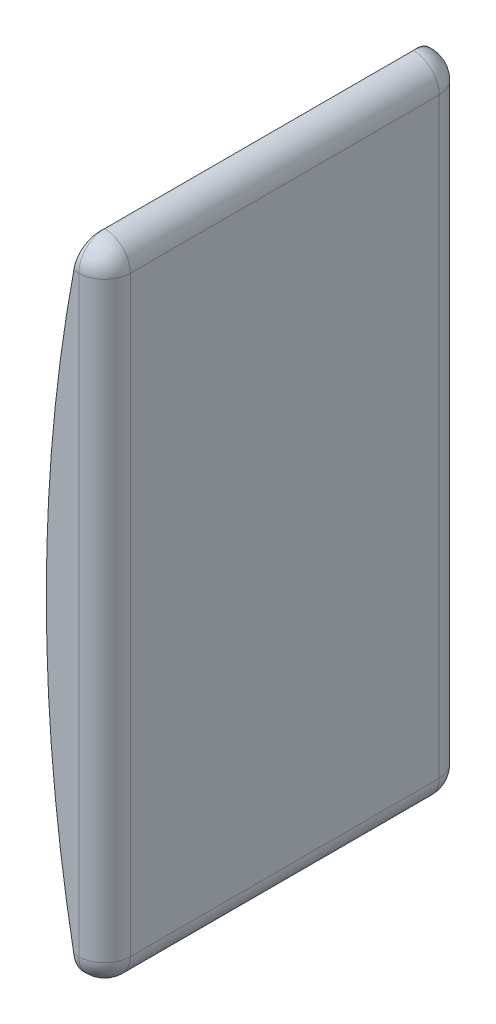
ISO-10303-21;
HEADER;
FILE_DESCRIPTION(('STEP AP214'),'2;1');
FILE_NAME('part.step','',(''),(''),'','','');
FILE_SCHEMA(('AUTOMOTIVE_DESIGN { 1 0 10303 214 1 1 1 1 }'));
ENDSEC;
DATA;
#1=APPLICATION_CONTEXT('core data for automotive mechanical design processes');
#2=APPLICATION_PROTOCOL_DEFINITION('international standard','automotive_design',2000,#1);
#3=PRODUCT_CONTEXT('',#1,'mechanical');
#4=PRODUCT('Part','Part','',(#3));
#5=PRODUCT_RELATED_PRODUCT_CATEGORY('part','',(#4));
#6=PRODUCT_DEFINITION_FORMATION('','',#4);
#7=PRODUCT_DEFINITION_CONTEXT('part definition',#1,'design');
#8=PRODUCT_DEFINITION('design','',#6,#7);
#9=PRODUCT_DEFINITION_SHAPE('','',#8);
#10=(LENGTH_UNIT() NAMED_UNIT(*) SI_UNIT(.MILLI.,.METRE.));
#11=(NAMED_UNIT(*) PLANE_ANGLE_UNIT() SI_UNIT($,.RADIAN.));
#12=(NAMED_UNIT(*) SI_UNIT($,.STERADIAN.) SOLID_ANGLE_UNIT());
#13=UNCERTAINTY_MEASURE_WITH_UNIT(LENGTH_MEASURE(1.E-05),#10,'distance_accuracy_value','');
#14=(GEOMETRIC_REPRESENTATION_CONTEXT(3) GLOBAL_UNCERTAINTY_ASSIGNED_CONTEXT((#13)) GLOBAL_UNIT_ASSIGNED_CONTEXT((#10,
#11,#12)) REPRESENTATION_CONTEXT('',''));
#15=CARTESIAN_POINT('',(0.,0.,0.));
#16=DIRECTION('',(0.,0.,1.));
#17=DIRECTION('',(1.,0.,0.));
#18=AXIS2_PLACEMENT_3D('',#15,#16,#17);
#19=CARTESIAN_POINT('',(2.65,-1.25,2.6));
#20=DIRECTION('',(0.,1.,0.));
#21=DIRECTION('',(0.707106781186548,0.,0.707106781186548));
#22=AXIS2_PLACEMENT_3D('',#19,#20,#21);
#23=CYLINDRICAL_SURFACE('',#22,0.2);
#24=CARTESIAN_POINT('',(2.65,-2.3,2.6));
#25=DIRECTION('',(0.,1.,0.));
#26=DIRECTION('',(0.,0.,1.));
#27=AXIS2_PLACEMENT_3D('',#24,#25,#26);
#28=CIRCLE('',#27,0.2);
#29=CARTESIAN_POINT('',(2.65,-2.3,2.8));
#30=VERTEX_POINT('',#29);
#31=CARTESIAN_POINT('',(2.85,-2.3,2.6));
#32=VERTEX_POINT('',#31);
#33=EDGE_CURVE('E11',#30,#32,#28,.T.);
#34=ORIENTED_EDGE('',*,*,#33,.T.);
#35=DIRECTION('',(0.,1.,0.));
#36=VECTOR('',#35,1.);
#37=CARTESIAN_POINT('',(2.85,-1.25,2.6));
#38=LINE('',#37,#36);
#39=CARTESIAN_POINT('',(2.85,2.3,2.6));
#40=VERTEX_POINT('',#39);
#41=EDGE_CURVE('E24',#32,#40,#38,.T.);
#42=ORIENTED_EDGE('',*,*,#41,.T.);
#43=CARTESIAN_POINT('',(2.65,2.3,2.6));
#44=DIRECTION('',(0.,-1.,0.));
#45=DIRECTION('',(1.,0.,0.));
#46=AXIS2_PLACEMENT_3D('',#43,#44,#45);
#47=CIRCLE('',#46,0.2);
#48=CARTESIAN_POINT('',(2.65,2.3,2.8));
#49=VERTEX_POINT('',#48);
#50=EDGE_CURVE('E431',#40,#49,#47,.T.);
#51=ORIENTED_EDGE('',*,*,#50,.T.);
#52=DIRECTION('',(0.,-1.,0.));
#53=VECTOR('',#52,1.);
#54=CARTESIAN_POINT('',(2.65,-1.25,2.8));
#55=LINE('',#54,#53);
#56=EDGE_CURVE('E107',#49,#30,#55,.T.);
#57=ORIENTED_EDGE('',*,*,#56,.T.);
#58=EDGE_LOOP('',(#34,#42,#51,#57));
#59=FACE_BOUND('',#58,.T.);
#60=ADVANCED_FACE('F17',(#59),#23,.T.);
#61=CARTESIAN_POINT('',(2.65,2.3,0.));
#62=DIRECTION('',(0.,0.,1.));
#63=DIRECTION('',(0.707106781186548,0.707106781186548,0.));
#64=AXIS2_PLACEMENT_3D('',#61,#62,#63);
#65=CYLINDRICAL_SURFACE('',#64,0.2);
#66=CARTESIAN_POINT('',(2.65,2.3,0.2));
#67=DIRECTION('',(0.,0.,1.));
#68=DIRECTION('',(1.,0.,0.));
#69=AXIS2_PLACEMENT_3D('',#66,#67,#68);
#70=CIRCLE('',#69,0.2);
#71=CARTESIAN_POINT('',(2.85,2.3,0.2));
#72=VERTEX_POINT('',#71);
#73=CARTESIAN_POINT('',(2.65,2.5,0.2));
#74=VERTEX_POINT('',#73);
#75=EDGE_CURVE('E206',#72,#74,#70,.T.);
#76=ORIENTED_EDGE('',*,*,#75,.T.);
#77=DIRECTION('',(0.,0.,1.));
#78=VECTOR('',#77,1.);
#79=CARTESIAN_POINT('',(2.65,2.5,2.8));
#80=LINE('',#79,#78);
#81=CARTESIAN_POINT('',(2.65,2.5,2.6));
#82=VERTEX_POINT('',#81);
#83=EDGE_CURVE('E208',#74,#82,#80,.T.);
#84=ORIENTED_EDGE('',*,*,#83,.T.);
#85=CARTESIAN_POINT('',(2.65,2.3,2.6));
#86=DIRECTION('',(0.,0.,-1.));
#87=DIRECTION('',(0.,1.,0.));
#88=AXIS2_PLACEMENT_3D('',#85,#86,#87);
#89=CIRCLE('',#88,0.2);
#90=EDGE_CURVE('E216',#82,#40,#89,.T.);
#91=ORIENTED_EDGE('',*,*,#90,.T.);
#92=DIRECTION('',(0.,0.,-1.));
#93=VECTOR('',#92,1.);
#94=CARTESIAN_POINT('',(2.85,2.3,0.));
#95=LINE('',#94,#93);
#96=EDGE_CURVE('E211',#40,#72,#95,.T.);
#97=ORIENTED_EDGE('',*,*,#96,.T.);
#98=EDGE_LOOP('',(#76,#84,#91,#97));
#99=FACE_BOUND('',#98,.T.);
#100=ADVANCED_FACE('F197',(#99),#65,.T.);
#101=CARTESIAN_POINT('',(2.65,2.3,2.6));
#102=DIRECTION('',(0.408248290463864,0.408248290463857,-0.816496580927728));
#103=DIRECTION('',(0.577350269189632,0.577350269189623,0.577350269189622));
#104=AXIS2_PLACEMENT_3D('',#101,#102,#103);
#105=SPHERICAL_SURFACE('',#104,0.2);
#106=ORIENTED_EDGE('',*,*,#90,.F.);
#107=CARTESIAN_POINT('',(2.65,2.3,2.6));
#108=DIRECTION('',(1.,0.,0.));
#109=DIRECTION('',(0.,0.707106781186548,0.707106781186548));
#110=AXIS2_PLACEMENT_3D('',#107,#108,#109);
#111=CIRCLE('',#110,0.2);
#112=EDGE_CURVE('E101',#82,#49,#111,.T.);
#113=ORIENTED_EDGE('',*,*,#112,.T.);
#114=ORIENTED_EDGE('',*,*,#50,.F.);
#115=EDGE_LOOP('',(#106,#113,#114));
#116=FACE_BOUND('',#115,.T.);
#117=ADVANCED_FACE('F194',(#116),#105,.T.);
#118=CARTESIAN_POINT('',(2.65,-1.25,0.2));
#119=DIRECTION('',(0.,1.,0.));
#120=DIRECTION('',(0.707106781186548,0.,-0.707106781186547));
#121=AXIS2_PLACEMENT_3D('',#118,#119,#120);
#122=CYLINDRICAL_SURFACE('',#121,0.2);
#123=CARTESIAN_POINT('',(2.65,-2.3,0.2));
#124=DIRECTION('',(0.,1.,0.));
#125=DIRECTION('',(1.,0.,0.));
#126=AXIS2_PLACEMENT_3D('',#123,#124,#125);
#127=CIRCLE('',#126,0.2);
#128=CARTESIAN_POINT('',(2.85,-2.3,0.2));
#129=VERTEX_POINT('',#128);
#130=CARTESIAN_POINT('',(2.65,-2.3,0.));
#131=VERTEX_POINT('',#130);
#132=EDGE_CURVE('E417',#129,#131,#127,.T.);
#133=ORIENTED_EDGE('',*,*,#132,.T.);
#134=DIRECTION('',(0.,1.,0.));
#135=VECTOR('',#134,1.);
#136=CARTESIAN_POINT('',(2.65,-1.25,0.));
#137=LINE('',#136,#135);
#138=CARTESIAN_POINT('',(2.65,2.3,0.));
#139=VERTEX_POINT('',#138);
#140=EDGE_CURVE('E415',#131,#139,#137,.T.);
#141=ORIENTED_EDGE('',*,*,#140,.T.);
#142=CARTESIAN_POINT('',(2.65,2.3,0.2));
#143=DIRECTION('',(0.,-1.,0.));
#144=DIRECTION('',(0.,0.,-1.));
#145=AXIS2_PLACEMENT_3D('',#142,#143,#144);
#146=CIRCLE('',#145,0.2);
#147=EDGE_CURVE('E220',#139,#72,#146,.T.);
#148=ORIENTED_EDGE('',*,*,#147,.T.);
#149=DIRECTION('',(0.,-1.,0.));
#150=VECTOR('',#149,1.);
#151=CARTESIAN_POINT('',(2.85,-1.25,0.2));
#152=LINE('',#151,#150);
#153=EDGE_CURVE('E222',#72,#129,#152,.T.);
#154=ORIENTED_EDGE('',*,*,#153,.T.);
#155=EDGE_LOOP('',(#133,#141,#148,#154));
#156=FACE_BOUND('',#155,.T.);
#157=ADVANCED_FACE('F190',(#156),#122,.T.);
#158=CARTESIAN_POINT('',(2.65,2.3,0.2));
#159=DIRECTION('',(-0.408248290463864,-0.408248290463857,-0.816496580927729));
#160=DIRECTION('',(0.577350269189632,0.577350269189623,-0.577350269189622));
#161=AXIS2_PLACEMENT_3D('',#158,#159,#160);
#162=SPHERICAL_SURFACE('',#161,0.2);
#163=ORIENTED_EDGE('',*,*,#147,.F.);
#164=CARTESIAN_POINT('',(2.65,2.3,0.2));
#165=DIRECTION('',(1.,0.,0.));
#166=DIRECTION('',(0.,0.707106781186548,-0.707106781186547));
#167=AXIS2_PLACEMENT_3D('',#164,#165,#166);
#168=CIRCLE('',#167,0.2);
#169=EDGE_CURVE('E219',#139,#74,#168,.T.);
#170=ORIENTED_EDGE('',*,*,#169,.T.);
#171=ORIENTED_EDGE('',*,*,#75,.F.);
#172=EDGE_LOOP('',(#163,#170,#171));
#173=FACE_BOUND('',#172,.T.);
#174=ADVANCED_FACE('F186',(#173),#162,.T.);
#175=CARTESIAN_POINT('',(2.65,-2.3,0.));
#176=DIRECTION('',(0.,0.,1.));
#177=DIRECTION('',(0.707106781186548,-0.707106781186548,0.));
#178=AXIS2_PLACEMENT_3D('',#175,#176,#177);
#179=CYLINDRICAL_SURFACE('',#178,0.2);
#180=CARTESIAN_POINT('',(2.65,-2.3,0.2));
#181=DIRECTION('',(0.,0.,1.));
#182=DIRECTION('',(0.,-1.,0.));
#183=AXIS2_PLACEMENT_3D('',#180,#181,#182);
#184=CIRCLE('',#183,0.2);
#185=CARTESIAN_POINT('',(2.65,-2.5,0.2));
#186=VERTEX_POINT('',#185);
#187=EDGE_CURVE('E223',#186,#129,#184,.T.);
#188=ORIENTED_EDGE('',*,*,#187,.T.);
#189=DIRECTION('',(0.,0.,1.));
#190=VECTOR('',#189,1.);
#191=CARTESIAN_POINT('',(2.85,-2.3,0.));
#192=LINE('',#191,#190);
#193=EDGE_CURVE('E404',#129,#32,#192,.T.);
#194=ORIENTED_EDGE('',*,*,#193,.T.);
#195=CARTESIAN_POINT('',(2.65,-2.3,2.6));
#196=DIRECTION('',(0.,0.,-1.));
#197=DIRECTION('',(1.,0.,0.));
#198=AXIS2_PLACEMENT_3D('',#195,#196,#197);
#199=CIRCLE('',#198,0.2);
#200=CARTESIAN_POINT('',(2.65,-2.5,2.6));
#201=VERTEX_POINT('',#200);
#202=EDGE_CURVE('E262',#32,#201,#199,.T.);
#203=ORIENTED_EDGE('',*,*,#202,.T.);
#204=DIRECTION('',(0.,0.,-1.));
#205=VECTOR('',#204,1.);
#206=CARTESIAN_POINT('',(2.65,-2.5,2.8));
#207=LINE('',#206,#205);
#208=EDGE_CURVE('E258',#201,#186,#207,.T.);
#209=ORIENTED_EDGE('',*,*,#208,.T.);
#210=EDGE_LOOP('',(#188,#194,#203,#209));
#211=FACE_BOUND('',#210,.T.);
#212=ADVANCED_FACE('F182',(#211),#179,.T.);
#213=CARTESIAN_POINT('',(2.65,-2.3,0.2));
#214=DIRECTION('',(-0.408248290463864,0.408248290463857,-0.816496580927729));
#215=DIRECTION('',(0.577350269189632,-0.577350269189623,-0.577350269189622));
#216=AXIS2_PLACEMENT_3D('',#213,#214,#215);
#217=SPHERICAL_SURFACE('',#216,0.2);
#218=ORIENTED_EDGE('',*,*,#187,.F.);
#219=CARTESIAN_POINT('',(2.65,-2.3,0.2));
#220=DIRECTION('',(1.,0.,0.));
#221=DIRECTION('',(0.,-0.707106781186548,-0.707106781186547));
#222=AXIS2_PLACEMENT_3D('',#219,#220,#221);
#223=CIRCLE('',#222,0.2);
#224=EDGE_CURVE('E257',#186,#131,#223,.T.);
#225=ORIENTED_EDGE('',*,*,#224,.T.);
#226=ORIENTED_EDGE('',*,*,#132,.F.);
#227=EDGE_LOOP('',(#218,#225,#226));
#228=FACE_BOUND('',#227,.T.);
#229=ADVANCED_FACE('F179',(#228),#217,.T.);
#230=CARTESIAN_POINT('',(2.65,-2.3,2.6));
#231=DIRECTION('',(0.408248290463864,-0.408248290463857,-0.816496580927728));
#232=DIRECTION('',(0.577350269189632,-0.577350269189623,0.577350269189622));
#233=AXIS2_PLACEMENT_3D('',#230,#231,#232);
#234=SPHERICAL_SURFACE('',#233,0.2);
#235=ORIENTED_EDGE('',*,*,#33,.F.);
#236=CARTESIAN_POINT('',(2.65,-2.3,2.6));
#237=DIRECTION('',(1.,0.,0.));
#238=DIRECTION('',(0.,-0.707106781186548,0.707106781186548));
#239=AXIS2_PLACEMENT_3D('',#236,#237,#238);
#240=CIRCLE('',#239,0.2);
#241=EDGE_CURVE('E226',#30,#201,#240,.T.);
#242=ORIENTED_EDGE('',*,*,#241,.T.);
#243=ORIENTED_EDGE('',*,*,#202,.F.);
#244=EDGE_LOOP('',(#235,#242,#243));
#245=FACE_BOUND('',#244,.T.);
#246=ADVANCED_FACE('F175',(#245),#234,.T.);
#247=CARTESIAN_POINT('',(1.425,2.3,0.2));
#248=DIRECTION('',(-1.,0.,0.));
#249=DIRECTION('',(0.,0.707106781186548,-0.707106781186547));
#250=AXIS2_PLACEMENT_3D('',#247,#248,#249);
#251=CYLINDRICAL_SURFACE('',#250,0.2);
#252=ORIENTED_EDGE('',*,*,#169,.F.);
#253=DIRECTION('',(-1.,0.,0.));
#254=VECTOR('',#253,1.);
#255=CARTESIAN_POINT('',(1.425,2.3,0.));
#256=LINE('',#255,#254);
#257=CARTESIAN_POINT('',(2.610811233646,2.3,0.));
#258=VERTEX_POINT('',#257);
#259=EDGE_CURVE('E225',#139,#258,#256,.T.);
#260=ORIENTED_EDGE('',*,*,#259,.T.);
#261=CARTESIAN_POINT('',(2.610811233646,2.3,0.));
#262=CARTESIAN_POINT('',(2.61121944996219,2.30327249565218,-6.94177549880552E-08));
#263=CARTESIAN_POINT('',(2.61162766627838,2.30654498539759,8.03165749694721E-05));
#264=CARTESIAN_POINT('',(2.61244409891075,2.31308208433338,0.000401500942961578));
#265=CARTESIAN_POINT('',(2.61285231522694,2.31634669352377,0.000642299318229225));
#266=CARTESIAN_POINT('',(2.61366874785931,2.32286016260805,0.00128381001289199));
#267=CARTESIAN_POINT('',(2.6140769641755,2.32610902250195,0.00168452233228711));
#268=CARTESIAN_POINT('',(2.61489339680787,2.3325831672802,0.00264487368180054));
#269=CARTESIAN_POINT('',(2.61530161312406,2.33580845216455,0.00320451271191886));
#270=CARTESIAN_POINT('',(2.61611804575644,2.3422276766419,0.00448137512678894));
#271=CARTESIAN_POINT('',(2.61652626207262,2.34542161623488,0.00519859851154071));
#272=CARTESIAN_POINT('',(2.617342694705,2.35177045572642,0.00678890021064178));
#273=CARTESIAN_POINT('',(2.61775091102119,2.35492535562498,0.00766197852499108));
#274=CARTESIAN_POINT('',(2.61856734365356,2.3611885152768,0.00956188718212532));
#275=CARTESIAN_POINT('',(2.61897555996975,2.36429677503006,0.0105887175249102));
#276=CARTESIAN_POINT('',(2.61979199260213,2.37045916632683,0.0127936564018815));
#277=CARTESIAN_POINT('',(2.62020020891831,2.37351329787033,0.0139717649360679));
#278=CARTESIAN_POINT('',(2.62101664155069,2.3795600750757,0.0164764220594174));
#279=CARTESIAN_POINT('',(2.62142485786688,2.38255272073757,0.0178029706485806));
#280=CARTESIAN_POINT('',(2.62224129049925,2.38846931663454,0.020601312102042));
#281=CARTESIAN_POINT('',(2.62264950681544,2.39139326686964,0.0220731049663402));
#282=CARTESIAN_POINT('',(2.62346593944781,2.39716542786075,0.0251583892943177));
#283=CARTESIAN_POINT('',(2.623874155764,2.40001363861676,0.0267718807579971));
#284=CARTESIAN_POINT('',(2.62469058839638,2.40562745906053,0.0301366752418941));
#285=CARTESIAN_POINT('',(2.62509880471256,2.40839306874828,0.0318879782621119));
#286=CARTESIAN_POINT('',(2.62591523734494,2.41383502445956,0.03552417681687));
#287=CARTESIAN_POINT('',(2.62632345366112,2.41651137048308,0.0374090723514104));
#288=CARTESIAN_POINT('',(2.6271398862935,2.42176835131389,0.0413079150563317));
#289=CARTESIAN_POINT('',(2.62754810260969,2.42434898612119,0.0433218622267127));
#290=CARTESIAN_POINT('',(2.62836453524206,2.42940832754427,0.0474739564281924));
#291=CARTESIAN_POINT('',(2.62877275155825,2.43188703416005,0.0496121034592911));
#292=CARTESIAN_POINT('',(2.62958918419063,2.43673654777876,0.0540074463987253));
#293=CARTESIAN_POINT('',(2.62999740050681,2.43910735478168,0.056264642307061));
#294=CARTESIAN_POINT('',(2.63081383313919,2.44373535769294,0.06089264521832));
#295=CARTESIAN_POINT('',(2.63122204945538,2.44599255360127,0.0632634522212433));
#296=CARTESIAN_POINT('',(2.63203848208775,2.45038789654071,0.0681129658399492));
#297=CARTESIAN_POINT('',(2.63244669840394,2.45252604357181,0.0705916724557318));
#298=CARTESIAN_POINT('',(2.63326313103631,2.45667813777329,0.0756510138788099));
#299=CARTESIAN_POINT('',(2.6336713473525,2.45869208494367,0.0782316486861055));
#300=CARTESIAN_POINT('',(2.63448777998487,2.46259092764859,0.0834886295169212));
#301=CARTESIAN_POINT('',(2.63489599630106,2.46447582318313,0.0861649755404413));
#302=CARTESIAN_POINT('',(2.63571242893344,2.46811202173789,0.0916069312517176));
#303=CARTESIAN_POINT('',(2.63612064524962,2.46986332475811,0.0943725409394737));
#304=CARTESIAN_POINT('',(2.636937077882,2.473228119242,0.0999863613832374));
#305=CARTESIAN_POINT('',(2.63734529419819,2.47484161070568,0.102834572139245));
#306=CARTESIAN_POINT('',(2.63816172683056,2.47792689503366,0.108606733130356));
#307=CARTESIAN_POINT('',(2.63856994314675,2.47939868789796,0.111530683365458));
#308=CARTESIAN_POINT('',(2.63938637577913,2.48219702935142,0.117447279262428));
#309=CARTESIAN_POINT('',(2.63979459209531,2.48352357794058,0.120439924924296));
#310=CARTESIAN_POINT('',(2.64061102472769,2.48602823506393,0.126486702129668));
#311=CARTESIAN_POINT('',(2.64101924104388,2.48720634359812,0.129540833673173));
#312=CARTESIAN_POINT('',(2.64183567367625,2.48941128247509,0.135703224969938));
#313=CARTESIAN_POINT('',(2.64224388999244,2.49043811281787,0.138811484723198));
#314=CARTESIAN_POINT('',(2.64306032262481,2.49233802147501,0.145074644375017));
#315=CARTESIAN_POINT('',(2.643468538941,2.49321109978936,0.148229544273575));
#316=CARTESIAN_POINT('',(2.64428497157337,2.49480140148846,0.154578383765119));
#317=CARTESIAN_POINT('',(2.64469318788956,2.49551862487321,0.157772323358103));
#318=CARTESIAN_POINT('',(2.64550962052194,2.49679548728808,0.164191547835445));
#319=CARTESIAN_POINT('',(2.64591783683812,2.4973551263182,0.167416832719802));
#320=CARTESIAN_POINT('',(2.6467342694705,2.49831547766771,0.173890977498053));
#321=CARTESIAN_POINT('',(2.64714248578669,2.49871618998711,0.177139837391946));
#322=CARTESIAN_POINT('',(2.64795891841906,2.49935770068177,0.183653306476229));
#323=CARTESIAN_POINT('',(2.64836713473525,2.49959849905704,0.186917915666618));
#324=CARTESIAN_POINT('',(2.64918356736763,2.49991968342503,0.193455014602414));
#325=CARTESIAN_POINT('',(2.64959178368381,2.50000006941776,0.196727504347822));
#326=CARTESIAN_POINT('',(2.65,2.5,0.2));
#327=B_SPLINE_CURVE_WITH_KNOTS('',3,(#261,#262,#263,#264,#265,#266,#267,#268,#269,#270,#271,
#272,#273,#274,#275,#276,#277,#278,#279,#280,#281,#282,#283,#284,#285,#286,#287,#288,#289,#290,
#291,#292,#293,#294,#295,#296,#297,#298,#299,#300,#301,#302,#303,#304,#305,#306,#307,#308,#309,
#310,#311,#312,#313,#314,#315,#316,#317,#318,#319,#320,#321,#322,#323,#324,#325,#326),
.UNSPECIFIED.,.F.,.F.,(4,2,2,2,2,2,2,2,2,2,2,2,2,2,2,2,2,2,2,2,2,2,2,2,2,2,2,2,2,2,2,2,4),(0.,
0.00989258654920048,0.0197851730984011,0.0296777596476017,0.0395703461968024,0.0494629327460026,
0.0593555192952033,0.0692481058444037,0.0791406923936046,0.0890332789428051,0.0989258654920056,
0.108818452041206,0.118711038590407,0.128603625139607,0.138496211688808,0.148388798238008,
0.158281384787209,0.168173971336409,0.17806655788561,0.18795914443481,0.197851730984011,
0.207744317533212,0.217636904082412,0.227529490631613,0.237422077180813,0.247314663730014,
0.257207250279214,0.267099836828415,0.276992423377615,0.286885009926816,0.296777596476017,
0.306670183025217,0.316562769574418),.UNSPECIFIED.);
#328=EDGE_CURVE('E157',#258,#74,#327,.T.);
#329=ORIENTED_EDGE('',*,*,#328,.T.);
#330=EDGE_LOOP('',(#252,#260,#329));
#331=FACE_BOUND('',#330,.T.);
#332=ADVANCED_FACE('F164',(#331),#251,.T.);
#333=CARTESIAN_POINT('',(0.,0.,0.));
#334=DIRECTION('',(0.,0.,1.));
#335=DIRECTION('',(1.,0.,0.));
#336=AXIS2_PLACEMENT_3D('',#333,#334,#335);
#337=PLANE('',#336);
#338=ORIENTED_EDGE('',*,*,#140,.F.);
#339=DIRECTION('',(1.,0.,0.));
#340=VECTOR('',#339,1.);
#341=CARTESIAN_POINT('',(-1.425,-2.3,0.));
#342=LINE('',#341,#340);
#343=CARTESIAN_POINT('',(2.610811233646,-2.3,0.));
#344=VERTEX_POINT('',#343);
#345=EDGE_CURVE('E146',#344,#131,#342,.T.);
#346=ORIENTED_EDGE('',*,*,#345,.F.);
#347=CARTESIAN_POINT('',(14.878813634275,0.,0.));
#348=DIRECTION('',(0.,0.,-1.));
#349=DIRECTION('',(0.979736133950161,-0.200292555609022,0.));
#350=AXIS2_PLACEMENT_3D('',#347,#348,#349);
#351=CIRCLE('',#350,12.481741981864);
#352=EDGE_CURVE('E229',#344,#258,#351,.T.);
#353=ORIENTED_EDGE('',*,*,#352,.T.);
#354=ORIENTED_EDGE('',*,*,#259,.F.);
#355=EDGE_LOOP('',(#338,#346,#353,#354));
#356=FACE_BOUND('',#355,.T.);
#357=ADVANCED_FACE('F174',(#356),#337,.F.);
#358=CARTESIAN_POINT('',(-1.425,-2.3,0.2));
#359=DIRECTION('',(1.,0.,0.));
#360=DIRECTION('',(0.,-0.707106781186548,-0.707106781186547));
#361=AXIS2_PLACEMENT_3D('',#358,#359,#360);
#362=CYLINDRICAL_SURFACE('',#361,0.2);
#363=ORIENTED_EDGE('',*,*,#224,.F.);
#364=CARTESIAN_POINT('',(2.65,-2.5,0.2));
#365=CARTESIAN_POINT('',(2.64959178368381,-2.50000006941776,0.196727504347822));
#366=CARTESIAN_POINT('',(2.64918356736762,-2.49991968342503,0.193455014602414));
#367=CARTESIAN_POINT('',(2.64836713473525,-2.49959849905704,0.186917915666618));
#368=CARTESIAN_POINT('',(2.64795891841906,-2.49935770068177,0.183653306476229));
#369=CARTESIAN_POINT('',(2.64714248578669,-2.49871618998711,0.177139837391947));
#370=CARTESIAN_POINT('',(2.6467342694705,-2.49831547766771,0.173890977498053));
#371=CARTESIAN_POINT('',(2.64591783683812,-2.4973551263182,0.167416832719802));
#372=CARTESIAN_POINT('',(2.64550962052194,-2.49679548728808,0.164191547835445));
#373=CARTESIAN_POINT('',(2.64469318788956,-2.49551862487321,0.157772323358103));
#374=CARTESIAN_POINT('',(2.64428497157337,-2.49480140148846,0.154578383765119));
#375=CARTESIAN_POINT('',(2.643468538941,-2.49321109978936,0.148229544273575));
#376=CARTESIAN_POINT('',(2.64306032262481,-2.49233802147501,0.145074644375017));
#377=CARTESIAN_POINT('',(2.64224388999244,-2.49043811281787,0.138811484723198));
#378=CARTESIAN_POINT('',(2.64183567367625,-2.48941128247509,0.135703224969938));
#379=CARTESIAN_POINT('',(2.64101924104387,-2.48720634359812,0.129540833673173));
#380=CARTESIAN_POINT('',(2.64061102472769,-2.48602823506393,0.126486702129668));
#381=CARTESIAN_POINT('',(2.63979459209531,-2.48352357794058,0.120439924924296));
#382=CARTESIAN_POINT('',(2.63938637577912,-2.48219702935142,0.117447279262428));
#383=CARTESIAN_POINT('',(2.63856994314675,-2.47939868789796,0.111530683365458));
#384=CARTESIAN_POINT('',(2.63816172683056,-2.47792689503366,0.108606733130356));
#385=CARTESIAN_POINT('',(2.63734529419819,-2.47484161070568,0.102834572139245));
#386=CARTESIAN_POINT('',(2.636937077882,-2.473228119242,0.0999863613832375));
#387=CARTESIAN_POINT('',(2.63612064524962,-2.46986332475811,0.0943725409394737));
#388=CARTESIAN_POINT('',(2.63571242893344,-2.46811202173789,0.0916069312517176));
#389=CARTESIAN_POINT('',(2.63489599630106,-2.46447582318313,0.0861649755404413));
#390=CARTESIAN_POINT('',(2.63448777998487,-2.46259092764859,0.0834886295169211));
#391=CARTESIAN_POINT('',(2.6336713473525,-2.45869208494367,0.0782316486861053));
#392=CARTESIAN_POINT('',(2.63326313103631,-2.45667813777329,0.0756510138788097));
#393=CARTESIAN_POINT('',(2.63244669840394,-2.45252604357181,0.0705916724557317));
#394=CARTESIAN_POINT('',(2.63203848208775,-2.45038789654071,0.0681129658399492));
#395=CARTESIAN_POINT('',(2.63122204945537,-2.44599255360127,0.0632634522212433));
#396=CARTESIAN_POINT('',(2.63081383313919,-2.44373535769294,0.0608926452183199));
#397=CARTESIAN_POINT('',(2.62999740050681,-2.43910735478168,0.0562646423070609));
#398=CARTESIAN_POINT('',(2.62958918419063,-2.43673654777876,0.0540074463987253));
#399=CARTESIAN_POINT('',(2.62877275155825,-2.43188703416005,0.049612103459291));
#400=CARTESIAN_POINT('',(2.62836453524206,-2.42940832754427,0.0474739564281924));
#401=CARTESIAN_POINT('',(2.62754810260969,-2.42434898612119,0.0433218622267127));
#402=CARTESIAN_POINT('',(2.6271398862935,-2.42176835131389,0.0413079150563317));
#403=CARTESIAN_POINT('',(2.62632345366112,-2.41651137048308,0.0374090723514104));
#404=CARTESIAN_POINT('',(2.62591523734494,-2.41383502445956,0.03552417681687));
#405=CARTESIAN_POINT('',(2.62509880471256,-2.40839306874828,0.0318879782621119));
#406=CARTESIAN_POINT('',(2.62469058839637,-2.40562745906053,0.0301366752418942));
#407=CARTESIAN_POINT('',(2.623874155764,-2.40001363861676,0.0267718807579971));
#408=CARTESIAN_POINT('',(2.62346593944781,-2.39716542786075,0.0251583892943178));
#409=CARTESIAN_POINT('',(2.62264950681544,-2.39139326686964,0.0220731049663402));
#410=CARTESIAN_POINT('',(2.62224129049925,-2.38846931663454,0.0206013121020421));
#411=CARTESIAN_POINT('',(2.62142485786687,-2.38255272073757,0.0178029706485807));
#412=CARTESIAN_POINT('',(2.62101664155069,-2.3795600750757,0.0164764220594174));
#413=CARTESIAN_POINT('',(2.62020020891831,-2.37351329787033,0.0139717649360678));
#414=CARTESIAN_POINT('',(2.61979199260213,-2.37045916632683,0.0127936564018815));
#415=CARTESIAN_POINT('',(2.61897555996975,-2.36429677503006,0.0105887175249102));
#416=CARTESIAN_POINT('',(2.61856734365356,-2.3611885152768,0.00956188718212531));
#417=CARTESIAN_POINT('',(2.61775091102119,-2.35492535562498,0.00766197852499109));
#418=CARTESIAN_POINT('',(2.617342694705,-2.35177045572642,0.00678890021064176));
#419=CARTESIAN_POINT('',(2.61652626207262,-2.34542161623488,0.00519859851154072));
#420=CARTESIAN_POINT('',(2.61611804575644,-2.3422276766419,0.004481375126789));
#421=CARTESIAN_POINT('',(2.61530161312406,-2.33580845216455,0.00320451271191891));
#422=CARTESIAN_POINT('',(2.61489339680788,-2.3325831672802,0.00264487368180055));
#423=CARTESIAN_POINT('',(2.6140769641755,-2.32610902250195,0.0016845223322871));
#424=CARTESIAN_POINT('',(2.61366874785931,-2.32286016260805,0.00128381001289201));
#425=CARTESIAN_POINT('',(2.61285231522694,-2.31634669352377,0.000642299318229259));
#426=CARTESIAN_POINT('',(2.61244409891075,-2.31308208433338,0.000401500942961592));
#427=CARTESIAN_POINT('',(2.61162766627838,-2.30654498539759,8.03165749694584E-05));
#428=CARTESIAN_POINT('',(2.61121944996219,-2.30327249565218,-6.94177550121214E-08));
#429=CARTESIAN_POINT('',(2.610811233646,-2.3,0.));
#430=B_SPLINE_CURVE_WITH_KNOTS('',3,(#364,#365,#366,#367,#368,#369,#370,#371,#372,#373,#374,
#375,#376,#377,#378,#379,#380,#381,#382,#383,#384,#385,#386,#387,#388,#389,#390,#391,#392,#393,
#394,#395,#396,#397,#398,#399,#400,#401,#402,#403,#404,#405,#406,#407,#408,#409,#410,#411,#412,
#413,#414,#415,#416,#417,#418,#419,#420,#421,#422,#423,#424,#425,#426,#427,#428,#429),
.UNSPECIFIED.,.F.,.F.,(4,2,2,2,2,2,2,2,2,2,2,2,2,2,2,2,2,2,2,2,2,2,2,2,2,2,2,2,2,2,2,2,4),(0.,
0.00989258654920053,0.0197851730984011,0.0296777596476015,0.0395703461968022,0.0494629327460029,
0.0593555192952034,0.0692481058444039,0.0791406923936045,0.089033278942805,0.0989258654920056,
0.108818452041206,0.118711038590407,0.128603625139607,0.138496211688808,0.148388798238008,
0.158281384787209,0.168173971336409,0.17806655788561,0.187959144434811,0.197851730984011,
0.207744317533212,0.217636904082412,0.227529490631613,0.237422077180813,0.247314663730014,
0.257207250279214,0.267099836828415,0.276992423377615,0.286885009926816,0.296777596476016,
0.306670183025217,0.316562769574418),.UNSPECIFIED.);
#431=EDGE_CURVE('E233',#186,#344,#430,.T.);
#432=ORIENTED_EDGE('',*,*,#431,.T.);
#433=ORIENTED_EDGE('',*,*,#345,.T.);
#434=EDGE_LOOP('',(#363,#432,#433));
#435=FACE_BOUND('',#434,.T.);
#436=ADVANCED_FACE('F243',(#435),#362,.T.);
#437=CARTESIAN_POINT('',(2.85,-2.5,0.));
#438=DIRECTION('',(1.,0.,0.));
#439=DIRECTION('',(0.,1.,0.));
#440=AXIS2_PLACEMENT_3D('',#437,#438,#439);
#441=PLANE('',#440);
#442=ORIENTED_EDGE('',*,*,#41,.F.);
#443=ORIENTED_EDGE('',*,*,#193,.F.);
#444=ORIENTED_EDGE('',*,*,#153,.F.);
#445=ORIENTED_EDGE('',*,*,#96,.F.);
#446=EDGE_LOOP('',(#442,#443,#444,#445));
#447=FACE_BOUND('',#446,.T.);
#448=ADVANCED_FACE('F128',(#447),#441,.T.);
#449=CARTESIAN_POINT('',(14.878813634275,0.,2.8));
#450=DIRECTION('',(0.,0.,1.));
#451=DIRECTION('',(0.979736133950161,-0.200292555609022,0.));
#452=AXIS2_PLACEMENT_3D('',#449,#450,#451);
#453=CYLINDRICAL_SURFACE('',#452,12.481741981864);
#454=ORIENTED_EDGE('',*,*,#431,.F.);
#455=ORIENTED_EDGE('',*,*,#208,.F.);
#456=CARTESIAN_POINT('',(2.610811233646,-2.3,2.8));
#457=CARTESIAN_POINT('',(2.61121944996219,-2.30327249565218,2.80000006941775));
#458=CARTESIAN_POINT('',(2.61162766627838,-2.30654498539759,2.79991968342503));
#459=CARTESIAN_POINT('',(2.61244409891075,-2.31308208433338,2.79959849905704));
#460=CARTESIAN_POINT('',(2.61285231522694,-2.31634669352377,2.79935770068177));
#461=CARTESIAN_POINT('',(2.61366874785931,-2.32286016260805,2.79871618998711));
#462=CARTESIAN_POINT('',(2.6140769641755,-2.32610902250195,2.79831547766771));
#463=CARTESIAN_POINT('',(2.61489339680787,-2.3325831672802,2.7973551263182));
#464=CARTESIAN_POINT('',(2.61530161312406,-2.33580845216455,2.79679548728808));
#465=CARTESIAN_POINT('',(2.61611804575644,-2.3422276766419,2.79551862487321));
#466=CARTESIAN_POINT('',(2.61652626207263,-2.34542161623488,2.79480140148846));
#467=CARTESIAN_POINT('',(2.617342694705,-2.35177045572642,2.79321109978936));
#468=CARTESIAN_POINT('',(2.61775091102119,-2.35492535562498,2.79233802147501));
#469=CARTESIAN_POINT('',(2.61856734365356,-2.3611885152768,2.79043811281787));
#470=CARTESIAN_POINT('',(2.61897555996975,-2.36429677503006,2.78941128247509));
#471=CARTESIAN_POINT('',(2.61979199260213,-2.37045916632683,2.78720634359812));
#472=CARTESIAN_POINT('',(2.62020020891831,-2.37351329787033,2.78602823506393));
#473=CARTESIAN_POINT('',(2.62101664155069,-2.3795600750757,2.78352357794058));
#474=CARTESIAN_POINT('',(2.62142485786687,-2.38255272073757,2.78219702935142));
#475=CARTESIAN_POINT('',(2.62224129049925,-2.38846931663454,2.77939868789796));
#476=CARTESIAN_POINT('',(2.62264950681544,-2.39139326686964,2.77792689503366));
#477=CARTESIAN_POINT('',(2.62346593944781,-2.39716542786075,2.77484161070568));
#478=CARTESIAN_POINT('',(2.623874155764,-2.40001363861676,2.773228119242));
#479=CARTESIAN_POINT('',(2.62469058839637,-2.40562745906053,2.76986332475811));
#480=CARTESIAN_POINT('',(2.62509880471256,-2.40839306874828,2.76811202173789));
#481=CARTESIAN_POINT('',(2.62591523734494,-2.41383502445956,2.76447582318313));
#482=CARTESIAN_POINT('',(2.62632345366112,-2.41651137048308,2.76259092764859));
#483=CARTESIAN_POINT('',(2.6271398862935,-2.42176835131389,2.75869208494367));
#484=CARTESIAN_POINT('',(2.62754810260969,-2.42434898612119,2.75667813777329));
#485=CARTESIAN_POINT('',(2.62836453524206,-2.42940832754427,2.75252604357181));
#486=CARTESIAN_POINT('',(2.62877275155825,-2.43188703416005,2.75038789654071));
#487=CARTESIAN_POINT('',(2.62958918419063,-2.43673654777876,2.74599255360127));
#488=CARTESIAN_POINT('',(2.62999740050681,-2.43910735478168,2.74373535769294));
#489=CARTESIAN_POINT('',(2.63081383313919,-2.44373535769294,2.73910735478168));
#490=CARTESIAN_POINT('',(2.63122204945537,-2.44599255360127,2.73673654777876));
#491=CARTESIAN_POINT('',(2.63203848208775,-2.45038789654071,2.73188703416005));
#492=CARTESIAN_POINT('',(2.63244669840394,-2.45252604357181,2.72940832754427));
#493=CARTESIAN_POINT('',(2.63326313103631,-2.45667813777329,2.72434898612119));
#494=CARTESIAN_POINT('',(2.6336713473525,-2.45869208494367,2.72176835131389));
#495=CARTESIAN_POINT('',(2.63448777998487,-2.46259092764859,2.71651137048308));
#496=CARTESIAN_POINT('',(2.63489599630106,-2.46447582318313,2.71383502445956));
#497=CARTESIAN_POINT('',(2.63571242893344,-2.46811202173789,2.70839306874828));
#498=CARTESIAN_POINT('',(2.63612064524962,-2.46986332475811,2.70562745906053));
#499=CARTESIAN_POINT('',(2.636937077882,-2.473228119242,2.70001363861676));
#500=CARTESIAN_POINT('',(2.63734529419819,-2.47484161070568,2.69716542786075));
#501=CARTESIAN_POINT('',(2.63816172683056,-2.47792689503366,2.69139326686964));
#502=CARTESIAN_POINT('',(2.63856994314675,-2.47939868789796,2.68846931663454));
#503=CARTESIAN_POINT('',(2.63938637577912,-2.48219702935142,2.68255272073757));
#504=CARTESIAN_POINT('',(2.63979459209531,-2.48352357794058,2.6795600750757));
#505=CARTESIAN_POINT('',(2.64061102472769,-2.48602823506393,2.67351329787033));
#506=CARTESIAN_POINT('',(2.64101924104387,-2.48720634359812,2.67045916632683));
#507=CARTESIAN_POINT('',(2.64183567367625,-2.48941128247509,2.66429677503006));
#508=CARTESIAN_POINT('',(2.64224388999244,-2.49043811281787,2.6611885152768));
#509=CARTESIAN_POINT('',(2.64306032262481,-2.49233802147501,2.65492535562498));
#510=CARTESIAN_POINT('',(2.643468538941,-2.49321109978936,2.65177045572642));
#511=CARTESIAN_POINT('',(2.64428497157337,-2.49480140148846,2.64542161623488));
#512=CARTESIAN_POINT('',(2.64469318788956,-2.49551862487321,2.6422276766419));
#513=CARTESIAN_POINT('',(2.64550962052194,-2.49679548728808,2.63580845216455));
#514=CARTESIAN_POINT('',(2.64591783683812,-2.4973551263182,2.6325831672802));
#515=CARTESIAN_POINT('',(2.6467342694705,-2.49831547766771,2.62610902250195));
#516=CARTESIAN_POINT('',(2.64714248578669,-2.49871618998711,2.62286016260805));
#517=CARTESIAN_POINT('',(2.64795891841906,-2.49935770068177,2.61634669352377));
#518=CARTESIAN_POINT('',(2.64836713473525,-2.49959849905704,2.61308208433338));
#519=CARTESIAN_POINT('',(2.64918356736762,-2.49991968342503,2.60654498539758));
#520=CARTESIAN_POINT('',(2.64959178368381,-2.50000006941776,2.60327249565218));
#521=CARTESIAN_POINT('',(2.65,-2.5,2.6));
#522=B_SPLINE_CURVE_WITH_KNOTS('',3,(#456,#457,#458,#459,#460,#461,#462,#463,#464,#465,#466,
#467,#468,#469,#470,#471,#472,#473,#474,#475,#476,#477,#478,#479,#480,#481,#482,#483,#484,#485,
#486,#487,#488,#489,#490,#491,#492,#493,#494,#495,#496,#497,#498,#499,#500,#501,#502,#503,#504,
#505,#506,#507,#508,#509,#510,#511,#512,#513,#514,#515,#516,#517,#518,#519,#520,#521),
.UNSPECIFIED.,.F.,.F.,(4,2,2,2,2,2,2,2,2,2,2,2,2,2,2,2,2,2,2,2,2,2,2,2,2,2,2,2,2,2,2,2,4),(0.,
0.00989258654920048,0.0197851730984011,0.0296777596476013,0.039570346196802,0.0494629327460026,
0.0593555192952033,0.0692481058444042,0.0791406923936044,0.0890332789428049,0.0989258654920055,
0.108818452041206,0.118711038590407,0.128603625139607,0.138496211688808,0.148388798238008,
0.158281384787209,0.16817397133641,0.17806655788561,0.187959144434811,0.197851730984012,
0.207744317533212,0.217636904082412,0.227529490631613,0.237422077180814,0.247314663730014,
0.257207250279215,0.267099836828415,0.276992423377616,0.286885009926817,0.296777596476017,
0.306670183025217,0.316562769574418),.UNSPECIFIED.);
#523=CARTESIAN_POINT('',(2.610811233646,-2.3,2.8));
#524=VERTEX_POINT('',#523);
#525=EDGE_CURVE('E87',#524,#201,#522,.T.);
#526=ORIENTED_EDGE('',*,*,#525,.F.);
#527=CARTESIAN_POINT('',(14.878813634275,0.,2.8));
#528=DIRECTION('',(0.,0.,1.));
#529=DIRECTION('',(0.979736133950161,-0.200292555609022,0.));
#530=AXIS2_PLACEMENT_3D('',#527,#528,#529);
#531=CIRCLE('',#530,12.481741981864);
#532=CARTESIAN_POINT('',(2.610811233646,2.3,2.8));
#533=VERTEX_POINT('',#532);
#534=EDGE_CURVE('E78',#533,#524,#531,.T.);
#535=ORIENTED_EDGE('',*,*,#534,.F.);
#536=CARTESIAN_POINT('',(2.65,2.5,2.6));
#537=CARTESIAN_POINT('',(2.64959178368381,2.50000006941776,2.60327249565218));
#538=CARTESIAN_POINT('',(2.64918356736762,2.49991968342503,2.60654498539758));
#539=CARTESIAN_POINT('',(2.64836713473525,2.49959849905704,2.61308208433338));
#540=CARTESIAN_POINT('',(2.64795891841906,2.49935770068177,2.61634669352377));
#541=CARTESIAN_POINT('',(2.64714248578669,2.49871618998711,2.62286016260805));
#542=CARTESIAN_POINT('',(2.6467342694705,2.49831547766771,2.62610902250195));
#543=CARTESIAN_POINT('',(2.64591783683812,2.4973551263182,2.6325831672802));
#544=CARTESIAN_POINT('',(2.64550962052194,2.49679548728808,2.63580845216455));
#545=CARTESIAN_POINT('',(2.64469318788956,2.49551862487321,2.6422276766419));
#546=CARTESIAN_POINT('',(2.64428497157337,2.49480140148846,2.64542161623488));
#547=CARTESIAN_POINT('',(2.643468538941,2.49321109978936,2.65177045572642));
#548=CARTESIAN_POINT('',(2.64306032262481,2.49233802147501,2.65492535562498));
#549=CARTESIAN_POINT('',(2.64224388999244,2.49043811281787,2.6611885152768));
#550=CARTESIAN_POINT('',(2.64183567367625,2.48941128247509,2.66429677503006));
#551=CARTESIAN_POINT('',(2.64101924104388,2.48720634359812,2.67045916632683));
#552=CARTESIAN_POINT('',(2.64061102472769,2.48602823506393,2.67351329787033));
#553=CARTESIAN_POINT('',(2.63979459209531,2.48352357794058,2.6795600750757));
#554=CARTESIAN_POINT('',(2.63938637577913,2.48219702935142,2.68255272073757));
#555=CARTESIAN_POINT('',(2.63856994314675,2.47939868789796,2.68846931663454));
#556=CARTESIAN_POINT('',(2.63816172683056,2.47792689503366,2.69139326686964));
#557=CARTESIAN_POINT('',(2.63734529419819,2.47484161070568,2.69716542786075));
#558=CARTESIAN_POINT('',(2.636937077882,2.473228119242,2.70001363861676));
#559=CARTESIAN_POINT('',(2.63612064524962,2.46986332475811,2.70562745906053));
#560=CARTESIAN_POINT('',(2.63571242893344,2.46811202173789,2.70839306874828));
#561=CARTESIAN_POINT('',(2.63489599630106,2.46447582318313,2.71383502445956));
#562=CARTESIAN_POINT('',(2.63448777998487,2.46259092764859,2.71651137048308));
#563=CARTESIAN_POINT('',(2.6336713473525,2.45869208494367,2.72176835131389));
#564=CARTESIAN_POINT('',(2.63326313103631,2.45667813777329,2.72434898612119));
#565=CARTESIAN_POINT('',(2.63244669840394,2.45252604357181,2.72940832754427));
#566=CARTESIAN_POINT('',(2.63203848208775,2.45038789654071,2.73188703416005));
#567=CARTESIAN_POINT('',(2.63122204945538,2.44599255360127,2.73673654777876));
#568=CARTESIAN_POINT('',(2.63081383313919,2.44373535769294,2.73910735478168));
#569=CARTESIAN_POINT('',(2.62999740050681,2.43910735478168,2.74373535769294));
#570=CARTESIAN_POINT('',(2.62958918419063,2.43673654777876,2.74599255360127));
#571=CARTESIAN_POINT('',(2.62877275155825,2.43188703416005,2.75038789654071));
#572=CARTESIAN_POINT('',(2.62836453524206,2.42940832754427,2.75252604357181));
#573=CARTESIAN_POINT('',(2.62754810260969,2.42434898612119,2.75667813777329));
#574=CARTESIAN_POINT('',(2.6271398862935,2.42176835131389,2.75869208494367));
#575=CARTESIAN_POINT('',(2.62632345366112,2.41651137048308,2.76259092764859));
#576=CARTESIAN_POINT('',(2.62591523734494,2.41383502445956,2.76447582318313));
#577=CARTESIAN_POINT('',(2.62509880471256,2.40839306874828,2.76811202173789));
#578=CARTESIAN_POINT('',(2.62469058839637,2.40562745906053,2.76986332475811));
#579=CARTESIAN_POINT('',(2.623874155764,2.40001363861676,2.773228119242));
#580=CARTESIAN_POINT('',(2.62346593944781,2.39716542786075,2.77484161070568));
#581=CARTESIAN_POINT('',(2.62264950681544,2.39139326686964,2.77792689503366));
#582=CARTESIAN_POINT('',(2.62224129049925,2.38846931663454,2.77939868789796));
#583=CARTESIAN_POINT('',(2.62142485786688,2.38255272073757,2.78219702935142));
#584=CARTESIAN_POINT('',(2.62101664155069,2.3795600750757,2.78352357794058));
#585=CARTESIAN_POINT('',(2.62020020891831,2.37351329787033,2.78602823506393));
#586=CARTESIAN_POINT('',(2.61979199260213,2.37045916632683,2.78720634359812));
#587=CARTESIAN_POINT('',(2.61897555996975,2.36429677503006,2.78941128247509));
#588=CARTESIAN_POINT('',(2.61856734365356,2.3611885152768,2.79043811281787));
#589=CARTESIAN_POINT('',(2.61775091102119,2.35492535562498,2.79233802147501));
#590=CARTESIAN_POINT('',(2.617342694705,2.35177045572642,2.79321109978936));
#591=CARTESIAN_POINT('',(2.61652626207262,2.34542161623488,2.79480140148846));
#592=CARTESIAN_POINT('',(2.61611804575644,2.3422276766419,2.79551862487321));
#593=CARTESIAN_POINT('',(2.61530161312406,2.33580845216455,2.79679548728808));
#594=CARTESIAN_POINT('',(2.61489339680788,2.3325831672802,2.7973551263182));
#595=CARTESIAN_POINT('',(2.6140769641755,2.32610902250195,2.79831547766771));
#596=CARTESIAN_POINT('',(2.61366874785931,2.32286016260805,2.79871618998711));
#597=CARTESIAN_POINT('',(2.61285231522694,2.31634669352377,2.79935770068177));
#598=CARTESIAN_POINT('',(2.61244409891075,2.31308208433338,2.79959849905704));
#599=CARTESIAN_POINT('',(2.61162766627838,2.30654498539759,2.79991968342503));
#600=CARTESIAN_POINT('',(2.61121944996219,2.30327249565218,2.80000006941775));
#601=CARTESIAN_POINT('',(2.610811233646,2.3,2.8));
#602=B_SPLINE_CURVE_WITH_KNOTS('',3,(#536,#537,#538,#539,#540,#541,#542,#543,#544,#545,#546,
#547,#548,#549,#550,#551,#552,#553,#554,#555,#556,#557,#558,#559,#560,#561,#562,#563,#564,#565,
#566,#567,#568,#569,#570,#571,#572,#573,#574,#575,#576,#577,#578,#579,#580,#581,#582,#583,#584,
#585,#586,#587,#588,#589,#590,#591,#592,#593,#594,#595,#596,#597,#598,#599,#600,#601),
.UNSPECIFIED.,.F.,.F.,(4,2,2,2,2,2,2,2,2,2,2,2,2,2,2,2,2,2,2,2,2,2,2,2,2,2,2,2,2,2,2,2,4),(0.,
0.00989258654920091,0.0197851730984011,0.0296777596476022,0.0395703461968024,0.0494629327460031,
0.0593555192952034,0.0692481058444041,0.0791406923936045,0.089033278942805,0.098925865492006,
0.108818452041206,0.118711038590407,0.128603625139608,0.138496211688808,0.148388798238009,
0.158281384787209,0.16817397133641,0.17806655788561,0.187959144434811,0.197851730984012,
0.207744317533213,0.217636904082413,0.227529490631614,0.237422077180814,0.247314663730014,
0.257207250279215,0.267099836828416,0.276992423377617,0.286885009926817,0.296777596476017,
0.306670183025218,0.316562769574419),.UNSPECIFIED.);
#603=EDGE_CURVE('E83',#82,#533,#602,.T.);
#604=ORIENTED_EDGE('',*,*,#603,.F.);
#605=ORIENTED_EDGE('',*,*,#83,.F.);
#606=ORIENTED_EDGE('',*,*,#328,.F.);
#607=ORIENTED_EDGE('',*,*,#352,.F.);
#608=EDGE_LOOP('',(#454,#455,#526,#535,#604,#605,#606,#607));
#609=FACE_BOUND('',#608,.T.);
#610=ADVANCED_FACE('F81',(#609),#453,.T.);
#611=CARTESIAN_POINT('',(-1.425,-2.3,2.6));
#612=DIRECTION('',(1.,0.,0.));
#613=DIRECTION('',(0.,-0.707106781186548,0.707106781186548));
#614=AXIS2_PLACEMENT_3D('',#611,#612,#613);
#615=CYLINDRICAL_SURFACE('',#614,0.2);
#616=ORIENTED_EDGE('',*,*,#241,.F.);
#617=DIRECTION('',(-1.,0.,0.));
#618=VECTOR('',#617,1.);
#619=CARTESIAN_POINT('',(-1.425,-2.3,2.8));
#620=LINE('',#619,#618);
#621=EDGE_CURVE('E102',#30,#524,#620,.T.);
#622=ORIENTED_EDGE('',*,*,#621,.T.);
#623=ORIENTED_EDGE('',*,*,#525,.T.);
#624=EDGE_LOOP('',(#616,#622,#623));
#625=FACE_BOUND('',#624,.T.);
#626=ADVANCED_FACE('F127',(#625),#615,.T.);
#627=CARTESIAN_POINT('',(1.425,2.3,2.6));
#628=DIRECTION('',(-1.,0.,0.));
#629=DIRECTION('',(0.,0.707106781186548,0.707106781186548));
#630=AXIS2_PLACEMENT_3D('',#627,#628,#629);
#631=CYLINDRICAL_SURFACE('',#630,0.2);
#632=ORIENTED_EDGE('',*,*,#112,.F.);
#633=ORIENTED_EDGE('',*,*,#603,.T.);
#634=DIRECTION('',(1.,0.,0.));
#635=VECTOR('',#634,1.);
#636=CARTESIAN_POINT('',(1.425,2.3,2.8));
#637=LINE('',#636,#635);
#638=EDGE_CURVE('E99',#533,#49,#637,.T.);
#639=ORIENTED_EDGE('',*,*,#638,.T.);
#640=EDGE_LOOP('',(#632,#633,#639));
#641=FACE_BOUND('',#640,.T.);
#642=ADVANCED_FACE('F98',(#641),#631,.T.);
#643=CARTESIAN_POINT('',(0.,0.,2.8));
#644=DIRECTION('',(0.,0.,1.));
#645=DIRECTION('',(1.,0.,0.));
#646=AXIS2_PLACEMENT_3D('',#643,#644,#645);
#647=PLANE('',#646);
#648=ORIENTED_EDGE('',*,*,#56,.F.);
#649=ORIENTED_EDGE('',*,*,#638,.F.);
#650=ORIENTED_EDGE('',*,*,#534,.T.);
#651=ORIENTED_EDGE('',*,*,#621,.F.);
#652=EDGE_LOOP('',(#648,#649,#650,#651));
#653=FACE_BOUND('',#652,.T.);
#654=ADVANCED_FACE('F106',(#653),#647,.T.);
#655=CLOSED_SHELL('',(#60,#100,#117,#157,#174,#212,#229,#246,#332,#357,#436,#448,#610,#626,#642,#654));
#656=MANIFOLD_SOLID_BREP('B1',#655);
#657=ADVANCED_BREP_SHAPE_REPRESENTATION('',(#18,#656),#14);
#658=SHAPE_DEFINITION_REPRESENTATION(#9,#657);
ENDSEC;
END-ISO-10303-21;
